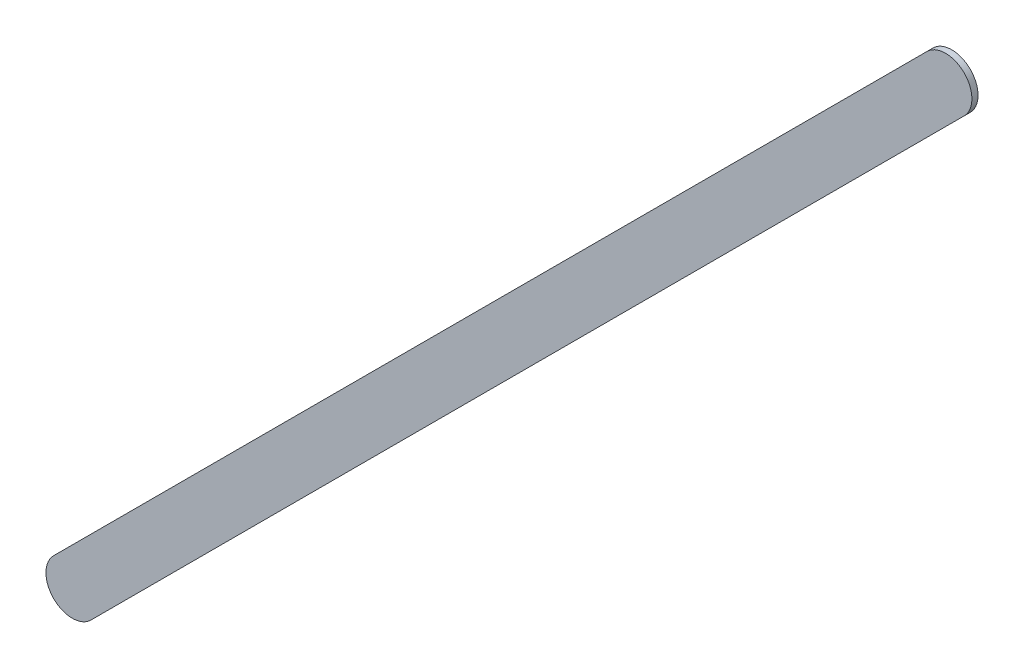
ISO-10303-21;
HEADER;
FILE_DESCRIPTION(('STEP AP214'),'2;1');
FILE_NAME('part.step','',(''),(''),'','','');
FILE_SCHEMA(('AUTOMOTIVE_DESIGN { 1 0 10303 214 1 1 1 1 }'));
ENDSEC;
DATA;
#1=APPLICATION_CONTEXT('core data for automotive mechanical design processes');
#2=APPLICATION_PROTOCOL_DEFINITION('international standard','automotive_design',2000,#1);
#3=PRODUCT_CONTEXT('',#1,'mechanical');
#4=PRODUCT('Part','Part','',(#3));
#5=PRODUCT_RELATED_PRODUCT_CATEGORY('part','',(#4));
#6=PRODUCT_DEFINITION_FORMATION('','',#4);
#7=PRODUCT_DEFINITION_CONTEXT('part definition',#1,'design');
#8=PRODUCT_DEFINITION('design','',#6,#7);
#9=PRODUCT_DEFINITION_SHAPE('','',#8);
#10=(LENGTH_UNIT() NAMED_UNIT(*) SI_UNIT(.MILLI.,.METRE.));
#11=(NAMED_UNIT(*) PLANE_ANGLE_UNIT() SI_UNIT($,.RADIAN.));
#12=(NAMED_UNIT(*) SI_UNIT($,.STERADIAN.) SOLID_ANGLE_UNIT());
#13=UNCERTAINTY_MEASURE_WITH_UNIT(LENGTH_MEASURE(1.E-05),#10,'distance_accuracy_value','');
#14=(GEOMETRIC_REPRESENTATION_CONTEXT(3) GLOBAL_UNCERTAINTY_ASSIGNED_CONTEXT((#13)) GLOBAL_UNIT_ASSIGNED_CONTEXT((#10,
#11,#12)) REPRESENTATION_CONTEXT('',''));
#15=CARTESIAN_POINT('',(0.,0.,0.));
#16=DIRECTION('',(0.,0.,1.));
#17=DIRECTION('',(1.,0.,0.));
#18=AXIS2_PLACEMENT_3D('',#15,#16,#17);
#19=CARTESIAN_POINT('',(123.363933,-85.663933,1.635));
#20=DIRECTION('',(0.,0.,1.));
#21=DIRECTION('',(1.,0.,0.));
#22=AXIS2_PLACEMENT_3D('',#19,#20,#21);
#23=PLANE('',#22);
#24=DIRECTION('',(-0.707106781186548,-0.707106781186548,0.));
#25=VECTOR('',#24,1.);
#26=CARTESIAN_POINT('',(123.363933,-85.663933,1.635));
#27=LINE('',#26,#25);
#28=CARTESIAN_POINT('',(123.363933,-85.663933,1.635));
#29=VERTEX_POINT('',#28);
#30=CARTESIAN_POINT('',(118.383933,-90.643933,1.635));
#31=VERTEX_POINT('',#30);
#32=EDGE_CURVE('E77',#29,#31,#27,.T.);
#33=ORIENTED_EDGE('',*,*,#32,.T.);
#34=CARTESIAN_POINT('',(118.4899995,-90.7499995,1.635));
#35=DIRECTION('',(0.,0.,1.));
#36=DIRECTION('',(-0.707106781186548,0.707106781186548,0.));
#37=AXIS2_PLACEMENT_3D('',#34,#35,#36);
#38=CIRCLE('',#37,0.150000682813);
#39=CARTESIAN_POINT('',(118.596066,-90.856066,1.635));
#40=VERTEX_POINT('',#39);
#41=EDGE_CURVE('E75',#31,#40,#38,.T.);
#42=ORIENTED_EDGE('',*,*,#41,.T.);
#43=DIRECTION('',(0.707106781186548,0.707106781186548,0.));
#44=VECTOR('',#43,1.);
#45=CARTESIAN_POINT('',(118.596066,-90.856066,1.635));
#46=LINE('',#45,#44);
#47=CARTESIAN_POINT('',(123.576066,-85.876066,1.635));
#48=VERTEX_POINT('',#47);
#49=EDGE_CURVE('E64',#40,#48,#46,.T.);
#50=ORIENTED_EDGE('',*,*,#49,.T.);
#51=CARTESIAN_POINT('',(123.4699995,-85.7699995,1.635));
#52=DIRECTION('',(0.,0.,1.));
#53=DIRECTION('',(0.707106781186548,-0.707106781186548,0.));
#54=AXIS2_PLACEMENT_3D('',#51,#52,#53);
#55=CIRCLE('',#54,0.150000682813);
#56=EDGE_CURVE('E11',#48,#29,#55,.T.);
#57=ORIENTED_EDGE('',*,*,#56,.T.);
#58=EDGE_LOOP('',(#33,#42,#50,#57));
#59=FACE_BOUND('',#58,.T.);
#60=ADVANCED_FACE('F17',(#59),#23,.T.);
#61=CARTESIAN_POINT('',(123.363933,-85.663933,1.6));
#62=DIRECTION('',(0.,0.,1.));
#63=DIRECTION('',(1.,0.,0.));
#64=AXIS2_PLACEMENT_3D('',#61,#62,#63);
#65=PLANE('',#64);
#66=CARTESIAN_POINT('',(123.4699995,-85.7699995,1.6));
#67=DIRECTION('',(0.,0.,1.));
#68=DIRECTION('',(0.707106781186548,-0.707106781186548,0.));
#69=AXIS2_PLACEMENT_3D('',#66,#67,#68);
#70=CIRCLE('',#69,0.150000682813);
#71=CARTESIAN_POINT('',(123.576066,-85.876066,1.6));
#72=VERTEX_POINT('',#71);
#73=CARTESIAN_POINT('',(123.363933,-85.663933,1.6));
#74=VERTEX_POINT('',#73);
#75=EDGE_CURVE('E20',#72,#74,#70,.T.);
#76=ORIENTED_EDGE('',*,*,#75,.F.);
#77=DIRECTION('',(0.707106781186548,0.707106781186548,0.));
#78=VECTOR('',#77,1.);
#79=CARTESIAN_POINT('',(118.596066,-90.856066,1.6));
#80=LINE('',#79,#78);
#81=CARTESIAN_POINT('',(118.596066,-90.856066,1.6));
#82=VERTEX_POINT('',#81);
#83=EDGE_CURVE('E82',#82,#72,#80,.T.);
#84=ORIENTED_EDGE('',*,*,#83,.F.);
#85=CARTESIAN_POINT('',(118.4899995,-90.7499995,1.6));
#86=DIRECTION('',(0.,0.,1.));
#87=DIRECTION('',(-0.707106781186548,0.707106781186548,0.));
#88=AXIS2_PLACEMENT_3D('',#85,#86,#87);
#89=CIRCLE('',#88,0.150000682813);
#90=CARTESIAN_POINT('',(118.383933,-90.643933,1.6));
#91=VERTEX_POINT('',#90);
#92=EDGE_CURVE('E85',#91,#82,#89,.T.);
#93=ORIENTED_EDGE('',*,*,#92,.F.);
#94=DIRECTION('',(-0.707106781186548,-0.707106781186548,0.));
#95=VECTOR('',#94,1.);
#96=CARTESIAN_POINT('',(123.363933,-85.663933,1.6));
#97=LINE('',#96,#95);
#98=EDGE_CURVE('E106',#74,#91,#97,.T.);
#99=ORIENTED_EDGE('',*,*,#98,.F.);
#100=EDGE_LOOP('',(#76,#84,#93,#99));
#101=FACE_BOUND('',#100,.T.);
#102=ADVANCED_FACE('F171',(#101),#65,.F.);
#103=CARTESIAN_POINT('',(123.4699995,-85.7699995,1.6));
#104=DIRECTION('',(0.,0.,-1.));
#105=DIRECTION('',(0.707106781186548,-0.707106781186548,0.));
#106=AXIS2_PLACEMENT_3D('',#103,#104,#105);
#107=CYLINDRICAL_SURFACE('',#106,0.150000682813);
#108=ORIENTED_EDGE('',*,*,#75,.T.);
#109=DIRECTION('',(0.,0.,1.));
#110=VECTOR('',#109,1.);
#111=CARTESIAN_POINT('',(123.363933,-85.663933,1.6));
#112=LINE('',#111,#110);
#113=EDGE_CURVE('E92',#74,#29,#112,.T.);
#114=ORIENTED_EDGE('',*,*,#113,.T.);
#115=ORIENTED_EDGE('',*,*,#56,.F.);
#116=DIRECTION('',(0.,0.,1.));
#117=VECTOR('',#116,1.);
#118=CARTESIAN_POINT('',(123.576066,-85.876066,1.6));
#119=LINE('',#118,#117);
#120=EDGE_CURVE('E71',#72,#48,#119,.T.);
#121=ORIENTED_EDGE('',*,*,#120,.F.);
#122=EDGE_LOOP('',(#108,#114,#115,#121));
#123=FACE_BOUND('',#122,.T.);
#124=ADVANCED_FACE('F163',(#123),#107,.T.);
#125=CARTESIAN_POINT('',(118.596066,-90.856066,1.6));
#126=DIRECTION('',(-0.707106781186548,0.707106781186548,0.));
#127=DIRECTION('',(0.,0.,1.));
#128=AXIS2_PLACEMENT_3D('',#125,#126,#127);
#129=PLANE('',#128);
#130=ORIENTED_EDGE('',*,*,#83,.T.);
#131=ORIENTED_EDGE('',*,*,#120,.T.);
#132=ORIENTED_EDGE('',*,*,#49,.F.);
#133=DIRECTION('',(0.,0.,1.));
#134=VECTOR('',#133,1.);
#135=CARTESIAN_POINT('',(118.596066,-90.856066,1.6));
#136=LINE('',#135,#134);
#137=EDGE_CURVE('E69',#82,#40,#136,.T.);
#138=ORIENTED_EDGE('',*,*,#137,.F.);
#139=EDGE_LOOP('',(#130,#131,#132,#138));
#140=FACE_BOUND('',#139,.T.);
#141=ADVANCED_FACE('F67',(#140),#129,.F.);
#142=CARTESIAN_POINT('',(118.4899995,-90.7499995,1.6));
#143=DIRECTION('',(0.,0.,-1.));
#144=DIRECTION('',(-0.707106781186548,0.707106781186548,0.));
#145=AXIS2_PLACEMENT_3D('',#142,#143,#144);
#146=CYLINDRICAL_SURFACE('',#145,0.150000682813);
#147=ORIENTED_EDGE('',*,*,#92,.T.);
#148=ORIENTED_EDGE('',*,*,#137,.T.);
#149=ORIENTED_EDGE('',*,*,#41,.F.);
#150=DIRECTION('',(0.,0.,1.));
#151=VECTOR('',#150,1.);
#152=CARTESIAN_POINT('',(118.383933,-90.643933,1.6));
#153=LINE('',#152,#151);
#154=EDGE_CURVE('E102',#91,#31,#153,.T.);
#155=ORIENTED_EDGE('',*,*,#154,.F.);
#156=EDGE_LOOP('',(#147,#148,#149,#155));
#157=FACE_BOUND('',#156,.T.);
#158=ADVANCED_FACE('F84',(#157),#146,.T.);
#159=CARTESIAN_POINT('',(123.363933,-85.663933,1.6));
#160=DIRECTION('',(0.707106781186548,-0.707106781186548,0.));
#161=DIRECTION('',(0.,0.,-1.));
#162=AXIS2_PLACEMENT_3D('',#159,#160,#161);
#163=PLANE('',#162);
#164=ORIENTED_EDGE('',*,*,#98,.T.);
#165=ORIENTED_EDGE('',*,*,#154,.T.);
#166=ORIENTED_EDGE('',*,*,#32,.F.);
#167=ORIENTED_EDGE('',*,*,#113,.F.);
#168=EDGE_LOOP('',(#164,#165,#166,#167));
#169=FACE_BOUND('',#168,.T.);
#170=ADVANCED_FACE('F144',(#169),#163,.F.);
#171=CLOSED_SHELL('',(#60,#102,#124,#141,#158,#170));
#172=MANIFOLD_SOLID_BREP('B1',#171);
#173=ADVANCED_BREP_SHAPE_REPRESENTATION('',(#18,#172),#14);
#174=SHAPE_DEFINITION_REPRESENTATION(#9,#173);
ENDSEC;
END-ISO-10303-21;
